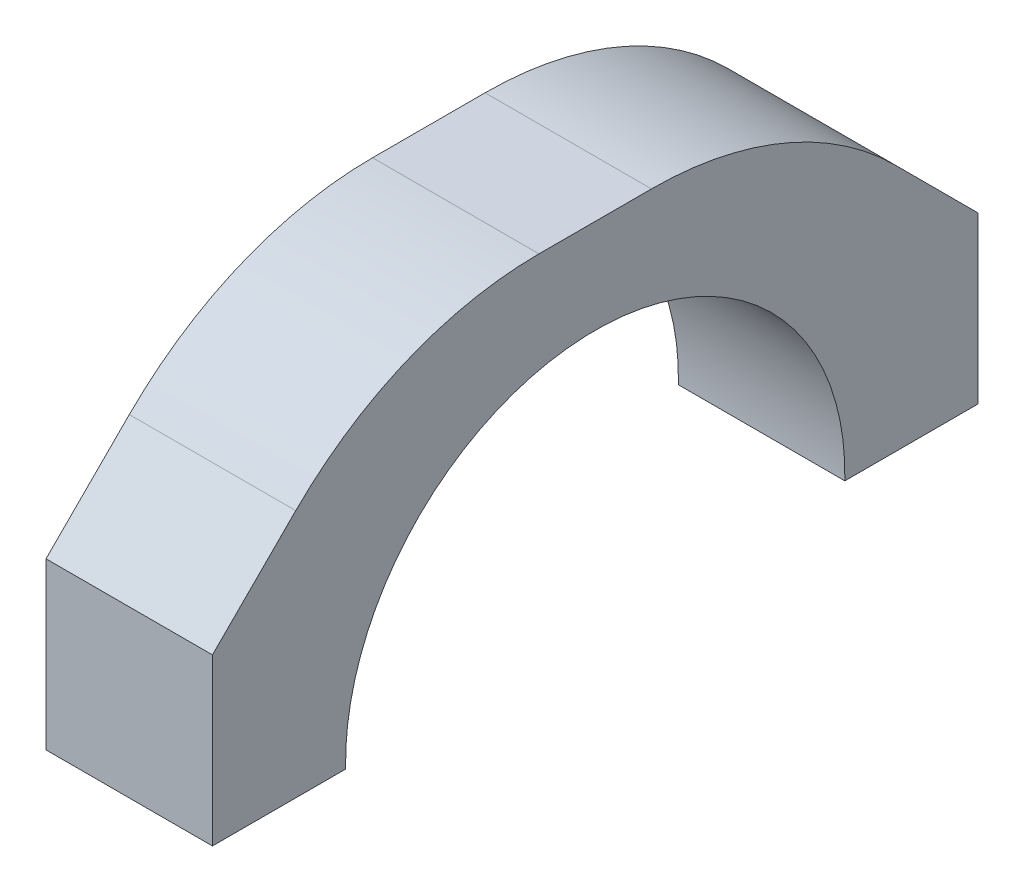
ISO-10303-21;
HEADER;
FILE_DESCRIPTION(('STEP AP214'),'2;1');
FILE_NAME('part.step','',(''),(''),'','','');
FILE_SCHEMA(('AUTOMOTIVE_DESIGN { 1 0 10303 214 1 1 1 1 }'));
ENDSEC;
DATA;
#1=APPLICATION_CONTEXT('core data for automotive mechanical design processes');
#2=APPLICATION_PROTOCOL_DEFINITION('international standard','automotive_design',2000,#1);
#3=PRODUCT_CONTEXT('',#1,'mechanical');
#4=PRODUCT('Part','Part','',(#3));
#5=PRODUCT_RELATED_PRODUCT_CATEGORY('part','',(#4));
#6=PRODUCT_DEFINITION_FORMATION('','',#4);
#7=PRODUCT_DEFINITION_CONTEXT('part definition',#1,'design');
#8=PRODUCT_DEFINITION('design','',#6,#7);
#9=PRODUCT_DEFINITION_SHAPE('','',#8);
#10=(LENGTH_UNIT() NAMED_UNIT(*) SI_UNIT(.MILLI.,.METRE.));
#11=(NAMED_UNIT(*) PLANE_ANGLE_UNIT() SI_UNIT($,.RADIAN.));
#12=(NAMED_UNIT(*) SI_UNIT($,.STERADIAN.) SOLID_ANGLE_UNIT());
#13=UNCERTAINTY_MEASURE_WITH_UNIT(LENGTH_MEASURE(1.E-05),#10,'distance_accuracy_value','');
#14=(GEOMETRIC_REPRESENTATION_CONTEXT(3) GLOBAL_UNCERTAINTY_ASSIGNED_CONTEXT((#13)) GLOBAL_UNIT_ASSIGNED_CONTEXT((#10,
#11,#12)) REPRESENTATION_CONTEXT('',''));
#15=CARTESIAN_POINT('',(0.,0.,0.));
#16=DIRECTION('',(0.,0.,1.));
#17=DIRECTION('',(1.,0.,0.));
#18=AXIS2_PLACEMENT_3D('',#15,#16,#17);
#19=CARTESIAN_POINT('',(-3.,-30.5,-34.4946802489415));
#20=DIRECTION('',(0.,0.,-1.));
#21=DIRECTION('',(-1.,0.,0.));
#22=AXIS2_PLACEMENT_3D('',#19,#20,#21);
#23=PLANE('',#22);
#24=DIRECTION('',(0.,1.,0.));
#25=VECTOR('',#24,1.);
#26=CARTESIAN_POINT('',(12.,-30.5,-34.4946802489415));
#27=LINE('',#26,#25);
#28=CARTESIAN_POINT('',(12.,-30.5,-34.4946802489415));
#29=VERTEX_POINT('',#28);
#30=CARTESIAN_POINT('',(12.,-15.585786437627,-34.4946802489415));
#31=VERTEX_POINT('',#30);
#32=EDGE_CURVE('E157',#29,#31,#27,.T.);
#33=ORIENTED_EDGE('',*,*,#32,.F.);
#34=DIRECTION('',(1.,0.,0.));
#35=VECTOR('',#34,1.);
#36=CARTESIAN_POINT('',(-3.,-30.5,-34.4946802489415));
#37=LINE('',#36,#35);
#38=CARTESIAN_POINT('',(-3.,-30.5,-34.4946802489415));
#39=VERTEX_POINT('',#38);
#40=EDGE_CURVE('E13',#39,#29,#37,.T.);
#41=ORIENTED_EDGE('',*,*,#40,.F.);
#42=DIRECTION('',(0.,1.,0.));
#43=VECTOR('',#42,1.);
#44=CARTESIAN_POINT('',(-3.,-30.5,-34.4946802489415));
#45=LINE('',#44,#43);
#46=CARTESIAN_POINT('',(-3.,-15.585786437627,-34.4946802489415));
#47=VERTEX_POINT('',#46);
#48=EDGE_CURVE('E183',#39,#47,#45,.T.);
#49=ORIENTED_EDGE('',*,*,#48,.T.);
#50=DIRECTION('',(1.,0.,0.));
#51=VECTOR('',#50,1.);
#52=CARTESIAN_POINT('',(-3.,-15.585786437627,-34.4946802489415));
#53=LINE('',#52,#51);
#54=EDGE_CURVE('E51',#47,#31,#53,.T.);
#55=ORIENTED_EDGE('',*,*,#54,.T.);
#56=EDGE_LOOP('',(#33,#41,#49,#55));
#57=FACE_BOUND('',#56,.T.);
#58=ADVANCED_FACE('F47',(#57),#23,.T.);
#59=CARTESIAN_POINT('',(-3.,-30.5,-22.494443758404));
#60=DIRECTION('',(0.,-1.,0.));
#61=DIRECTION('',(0.,0.,-1.));
#62=AXIS2_PLACEMENT_3D('',#59,#60,#61);
#63=PLANE('',#62);
#64=DIRECTION('',(0.,0.,-1.));
#65=VECTOR('',#64,1.);
#66=CARTESIAN_POINT('',(12.,-30.5,-22.494443758404));
#67=LINE('',#66,#65);
#68=CARTESIAN_POINT('',(12.,-30.5,-22.494443758404));
#69=VERTEX_POINT('',#68);
#70=EDGE_CURVE('E181',#69,#29,#67,.T.);
#71=ORIENTED_EDGE('',*,*,#70,.F.);
#72=DIRECTION('',(1.,0.,0.));
#73=VECTOR('',#72,1.);
#74=CARTESIAN_POINT('',(-3.,-30.5,-22.494443758404));
#75=LINE('',#74,#73);
#76=CARTESIAN_POINT('',(-3.,-30.5,-22.494443758404));
#77=VERTEX_POINT('',#76);
#78=EDGE_CURVE('E57',#77,#69,#75,.T.);
#79=ORIENTED_EDGE('',*,*,#78,.F.);
#80=DIRECTION('',(0.,0.,-1.));
#81=VECTOR('',#80,1.);
#82=CARTESIAN_POINT('',(-3.,-30.5,-22.494443758404));
#83=LINE('',#82,#81);
#84=EDGE_CURVE('E147',#77,#39,#83,.T.);
#85=ORIENTED_EDGE('',*,*,#84,.T.);
#86=ORIENTED_EDGE('',*,*,#40,.T.);
#87=EDGE_LOOP('',(#71,#79,#85,#86));
#88=FACE_BOUND('',#87,.T.);
#89=ADVANCED_FACE('F198',(#88),#63,.T.);
#90=CARTESIAN_POINT('',(-3.,-30.,0.));
#91=DIRECTION('',(1.,0.,0.));
#92=DIRECTION('',(0.,0.,-1.));
#93=AXIS2_PLACEMENT_3D('',#90,#91,#92);
#94=CYLINDRICAL_SURFACE('',#93,22.5);
#95=CARTESIAN_POINT('',(12.,-30.,0.));
#96=DIRECTION('',(-1.,0.,0.));
#97=DIRECTION('',(0.,0.,-1.));
#98=AXIS2_PLACEMENT_3D('',#95,#96,#97);
#99=CIRCLE('',#98,22.5);
#100=CARTESIAN_POINT('',(12.,-30.5,22.4944437584039));
#101=VERTEX_POINT('',#100);
#102=EDGE_CURVE('E134',#101,#69,#99,.T.);
#103=ORIENTED_EDGE('',*,*,#102,.F.);
#104=DIRECTION('',(1.,0.,0.));
#105=VECTOR('',#104,1.);
#106=CARTESIAN_POINT('',(-3.,-30.5,22.4944437584039));
#107=LINE('',#106,#105);
#108=CARTESIAN_POINT('',(-3.,-30.5,22.4944437584039));
#109=VERTEX_POINT('',#108);
#110=EDGE_CURVE('E129',#109,#101,#107,.T.);
#111=ORIENTED_EDGE('',*,*,#110,.F.);
#112=CARTESIAN_POINT('',(-3.,-30.,0.));
#113=DIRECTION('',(-1.,0.,0.));
#114=DIRECTION('',(0.,0.,-1.));
#115=AXIS2_PLACEMENT_3D('',#112,#113,#114);
#116=CIRCLE('',#115,22.5);
#117=EDGE_CURVE('E132',#109,#77,#116,.T.);
#118=ORIENTED_EDGE('',*,*,#117,.T.);
#119=ORIENTED_EDGE('',*,*,#78,.T.);
#120=EDGE_LOOP('',(#103,#111,#118,#119));
#121=FACE_BOUND('',#120,.T.);
#122=ADVANCED_FACE('F131',(#121),#94,.F.);
#123=CARTESIAN_POINT('',(-3.,-30.5,34.4946802489414));
#124=DIRECTION('',(0.,-1.,0.));
#125=DIRECTION('',(0.,0.,-1.));
#126=AXIS2_PLACEMENT_3D('',#123,#124,#125);
#127=PLANE('',#126);
#128=DIRECTION('',(0.,0.,-1.));
#129=VECTOR('',#128,1.);
#130=CARTESIAN_POINT('',(12.,-30.5,34.4946802489414));
#131=LINE('',#130,#129);
#132=CARTESIAN_POINT('',(12.,-30.5,34.4946802489414));
#133=VERTEX_POINT('',#132);
#134=EDGE_CURVE('E178',#133,#101,#131,.T.);
#135=ORIENTED_EDGE('',*,*,#134,.F.);
#136=DIRECTION('',(1.,0.,0.));
#137=VECTOR('',#136,1.);
#138=CARTESIAN_POINT('',(-3.,-30.5,34.4946802489414));
#139=LINE('',#138,#137);
#140=CARTESIAN_POINT('',(-3.,-30.5,34.4946802489414));
#141=VERTEX_POINT('',#140);
#142=EDGE_CURVE('E139',#141,#133,#139,.T.);
#143=ORIENTED_EDGE('',*,*,#142,.F.);
#144=DIRECTION('',(0.,0.,-1.));
#145=VECTOR('',#144,1.);
#146=CARTESIAN_POINT('',(-3.,-30.5,34.4946802489414));
#147=LINE('',#146,#145);
#148=EDGE_CURVE('E145',#141,#109,#147,.T.);
#149=ORIENTED_EDGE('',*,*,#148,.T.);
#150=ORIENTED_EDGE('',*,*,#110,.T.);
#151=EDGE_LOOP('',(#135,#143,#149,#150));
#152=FACE_BOUND('',#151,.T.);
#153=ADVANCED_FACE('F149',(#152),#127,.T.);
#154=CARTESIAN_POINT('',(-3.,-15.5857864376269,34.4946802489414));
#155=DIRECTION('',(0.,0.,1.));
#156=DIRECTION('',(1.,0.,0.));
#157=AXIS2_PLACEMENT_3D('',#154,#155,#156);
#158=PLANE('',#157);
#159=DIRECTION('',(0.,-1.,0.));
#160=VECTOR('',#159,1.);
#161=CARTESIAN_POINT('',(12.,-15.5857864376269,34.4946802489414));
#162=LINE('',#161,#160);
#163=CARTESIAN_POINT('',(12.,-15.5857864376269,34.4946802489414));
#164=VERTEX_POINT('',#163);
#165=EDGE_CURVE('E175',#164,#133,#162,.T.);
#166=ORIENTED_EDGE('',*,*,#165,.F.);
#167=DIRECTION('',(1.,0.,0.));
#168=VECTOR('',#167,1.);
#169=CARTESIAN_POINT('',(-3.,-15.5857864376269,34.4946802489414));
#170=LINE('',#169,#168);
#171=CARTESIAN_POINT('',(-3.,-15.5857864376269,34.4946802489414));
#172=VERTEX_POINT('',#171);
#173=EDGE_CURVE('E187',#172,#164,#170,.T.);
#174=ORIENTED_EDGE('',*,*,#173,.F.);
#175=DIRECTION('',(0.,-1.,0.));
#176=VECTOR('',#175,1.);
#177=CARTESIAN_POINT('',(-3.,-15.5857864376269,34.4946802489414));
#178=LINE('',#177,#176);
#179=EDGE_CURVE('E150',#172,#141,#178,.T.);
#180=ORIENTED_EDGE('',*,*,#179,.T.);
#181=ORIENTED_EDGE('',*,*,#142,.T.);
#182=EDGE_LOOP('',(#166,#174,#180,#181));
#183=FACE_BOUND('',#182,.T.);
#184=ADVANCED_FACE('F210',(#183),#158,.T.);
#185=CARTESIAN_POINT('',(-3.,-8.07968978321699,26.9885835945315));
#186=DIRECTION('',(0.,0.707106781186547,0.707106781186548));
#187=DIRECTION('',(0.,-0.707106781186548,0.707106781186547));
#188=AXIS2_PLACEMENT_3D('',#185,#186,#187);
#189=PLANE('',#188);
#190=DIRECTION('',(0.,-0.707106781186548,0.707106781186547));
#191=VECTOR('',#190,1.);
#192=CARTESIAN_POINT('',(12.,-8.07968978321699,26.9885835945315));
#193=LINE('',#192,#191);
#194=CARTESIAN_POINT('',(12.,-8.07968978321699,26.9885835945315));
#195=VERTEX_POINT('',#194);
#196=EDGE_CURVE('E172',#195,#164,#193,.T.);
#197=ORIENTED_EDGE('',*,*,#196,.F.);
#198=DIRECTION('',(1.,0.,0.));
#199=VECTOR('',#198,1.);
#200=CARTESIAN_POINT('',(-3.,-8.07968978321699,26.9885835945315));
#201=LINE('',#200,#199);
#202=CARTESIAN_POINT('',(-3.,-8.07968978321699,26.9885835945315));
#203=VERTEX_POINT('',#202);
#204=EDGE_CURVE('E189',#203,#195,#201,.T.);
#205=ORIENTED_EDGE('',*,*,#204,.F.);
#206=DIRECTION('',(0.,-0.707106781186548,0.707106781186547));
#207=VECTOR('',#206,1.);
#208=CARTESIAN_POINT('',(-3.,-8.07968978321699,26.9885835945315));
#209=LINE('',#208,#207);
#210=EDGE_CURVE('E152',#203,#172,#209,.T.);
#211=ORIENTED_EDGE('',*,*,#210,.T.);
#212=ORIENTED_EDGE('',*,*,#173,.T.);
#213=EDGE_LOOP('',(#197,#205,#211,#212));
#214=FACE_BOUND('',#213,.T.);
#215=ADVANCED_FACE('F213',(#214),#189,.T.);
#216=CARTESIAN_POINT('',(-3.,-30.,5.0682733777486));
#217=DIRECTION('',(1.,0.,0.));
#218=DIRECTION('',(0.,0.,-1.));
#219=AXIS2_PLACEMENT_3D('',#216,#217,#218);
#220=CYLINDRICAL_SURFACE('',#219,31.);
#221=CARTESIAN_POINT('',(12.,-30.,5.0682733777486));
#222=DIRECTION('',(1.,0.,0.));
#223=DIRECTION('',(0.,0.,-1.));
#224=AXIS2_PLACEMENT_3D('',#221,#222,#223);
#225=CIRCLE('',#224,31.);
#226=CARTESIAN_POINT('',(12.,1.,5.0682733777486));
#227=VERTEX_POINT('',#226);
#228=EDGE_CURVE('E169',#227,#195,#225,.T.);
#229=ORIENTED_EDGE('',*,*,#228,.F.);
#230=DIRECTION('',(1.,0.,0.));
#231=VECTOR('',#230,1.);
#232=CARTESIAN_POINT('',(-3.,1.,5.0682733777486));
#233=LINE('',#232,#231);
#234=CARTESIAN_POINT('',(-3.,1.,5.0682733777486));
#235=VERTEX_POINT('',#234);
#236=EDGE_CURVE('E191',#235,#227,#233,.T.);
#237=ORIENTED_EDGE('',*,*,#236,.F.);
#238=CARTESIAN_POINT('',(-3.,-30.,5.0682733777486));
#239=DIRECTION('',(1.,0.,0.));
#240=DIRECTION('',(0.,0.,-1.));
#241=AXIS2_PLACEMENT_3D('',#238,#239,#240);
#242=CIRCLE('',#241,31.);
#243=EDGE_CURVE('E316',#235,#203,#242,.T.);
#244=ORIENTED_EDGE('',*,*,#243,.T.);
#245=ORIENTED_EDGE('',*,*,#204,.T.);
#246=EDGE_LOOP('',(#229,#237,#244,#245));
#247=FACE_BOUND('',#246,.T.);
#248=ADVANCED_FACE('F217',(#247),#220,.T.);
#249=CARTESIAN_POINT('',(-3.,1.00000000000001,-5.06827337774855));
#250=DIRECTION('',(0.,1.,0.));
#251=DIRECTION('',(0.,0.,1.));
#252=AXIS2_PLACEMENT_3D('',#249,#250,#251);
#253=PLANE('',#252);
#254=DIRECTION('',(0.,0.,1.));
#255=VECTOR('',#254,1.);
#256=CARTESIAN_POINT('',(12.,1.00000000000001,-5.06827337774855));
#257=LINE('',#256,#255);
#258=CARTESIAN_POINT('',(12.,1.,-5.06827337774855));
#259=VERTEX_POINT('',#258);
#260=EDGE_CURVE('E166',#259,#227,#257,.T.);
#261=ORIENTED_EDGE('',*,*,#260,.F.);
#262=DIRECTION('',(1.,0.,0.));
#263=VECTOR('',#262,1.);
#264=CARTESIAN_POINT('',(-3.,1.,-5.06827337774855));
#265=LINE('',#264,#263);
#266=CARTESIAN_POINT('',(-3.,1.,-5.06827337774855));
#267=VERTEX_POINT('',#266);
#268=EDGE_CURVE('E193',#267,#259,#265,.T.);
#269=ORIENTED_EDGE('',*,*,#268,.F.);
#270=DIRECTION('',(0.,0.,1.));
#271=VECTOR('',#270,1.);
#272=CARTESIAN_POINT('',(-3.,1.00000000000001,-5.06827337774855));
#273=LINE('',#272,#271);
#274=EDGE_CURVE('E312',#267,#235,#273,.T.);
#275=ORIENTED_EDGE('',*,*,#274,.T.);
#276=ORIENTED_EDGE('',*,*,#236,.T.);
#277=EDGE_LOOP('',(#261,#269,#275,#276));
#278=FACE_BOUND('',#277,.T.);
#279=ADVANCED_FACE('F221',(#278),#253,.T.);
#280=CARTESIAN_POINT('',(-3.,-30.,-5.06827337774855));
#281=DIRECTION('',(1.,0.,0.));
#282=DIRECTION('',(0.,0.,-1.));
#283=AXIS2_PLACEMENT_3D('',#280,#281,#282);
#284=CYLINDRICAL_SURFACE('',#283,31.);
#285=CARTESIAN_POINT('',(12.,-30.,-5.06827337774855));
#286=DIRECTION('',(1.,0.,0.));
#287=DIRECTION('',(0.,0.,-1.));
#288=AXIS2_PLACEMENT_3D('',#285,#286,#287);
#289=CIRCLE('',#288,31.);
#290=CARTESIAN_POINT('',(12.,-8.07968978321706,-26.9885835945316));
#291=VERTEX_POINT('',#290);
#292=EDGE_CURVE('E163',#291,#259,#289,.T.);
#293=ORIENTED_EDGE('',*,*,#292,.F.);
#294=DIRECTION('',(1.,0.,0.));
#295=VECTOR('',#294,1.);
#296=CARTESIAN_POINT('',(-3.,-8.07968978321706,-26.9885835945316));
#297=LINE('',#296,#295);
#298=CARTESIAN_POINT('',(-3.,-8.07968978321706,-26.9885835945316));
#299=VERTEX_POINT('',#298);
#300=EDGE_CURVE('E194',#299,#291,#297,.T.);
#301=ORIENTED_EDGE('',*,*,#300,.F.);
#302=CARTESIAN_POINT('',(-3.,-30.,-5.06827337774855));
#303=DIRECTION('',(1.,0.,0.));
#304=DIRECTION('',(0.,0.,-1.));
#305=AXIS2_PLACEMENT_3D('',#302,#303,#304);
#306=CIRCLE('',#305,31.);
#307=EDGE_CURVE('E323',#299,#267,#306,.T.);
#308=ORIENTED_EDGE('',*,*,#307,.T.);
#309=ORIENTED_EDGE('',*,*,#268,.T.);
#310=EDGE_LOOP('',(#293,#301,#308,#309));
#311=FACE_BOUND('',#310,.T.);
#312=ADVANCED_FACE('F225',(#311),#284,.T.);
#313=CARTESIAN_POINT('',(-3.,-15.585786437627,-34.4946802489415));
#314=DIRECTION('',(0.,0.707106781186547,-0.707106781186548));
#315=DIRECTION('',(0.,0.707106781186548,0.707106781186547));
#316=AXIS2_PLACEMENT_3D('',#313,#314,#315);
#317=PLANE('',#316);
#318=DIRECTION('',(0.,0.707106781186548,0.707106781186547));
#319=VECTOR('',#318,1.);
#320=CARTESIAN_POINT('',(12.,-15.585786437627,-34.4946802489415));
#321=LINE('',#320,#319);
#322=EDGE_CURVE('E160',#31,#291,#321,.T.);
#323=ORIENTED_EDGE('',*,*,#322,.F.);
#324=ORIENTED_EDGE('',*,*,#54,.F.);
#325=DIRECTION('',(0.,0.707106781186548,0.707106781186547));
#326=VECTOR('',#325,1.);
#327=CARTESIAN_POINT('',(-3.,-15.585786437627,-34.4946802489415));
#328=LINE('',#327,#326);
#329=EDGE_CURVE('E325',#47,#299,#328,.T.);
#330=ORIENTED_EDGE('',*,*,#329,.T.);
#331=ORIENTED_EDGE('',*,*,#300,.T.);
#332=EDGE_LOOP('',(#323,#324,#330,#331));
#333=FACE_BOUND('',#332,.T.);
#334=ADVANCED_FACE('F196',(#333),#317,.T.);
#335=CARTESIAN_POINT('',(-3.,-30.,-5.06827337774855));
#336=DIRECTION('',(1.,0.,0.));
#337=DIRECTION('',(0.,0.,-1.));
#338=AXIS2_PLACEMENT_3D('',#335,#336,#337);
#339=PLANE('',#338);
#340=ORIENTED_EDGE('',*,*,#48,.F.);
#341=ORIENTED_EDGE('',*,*,#84,.F.);
#342=ORIENTED_EDGE('',*,*,#117,.F.);
#343=ORIENTED_EDGE('',*,*,#148,.F.);
#344=ORIENTED_EDGE('',*,*,#179,.F.);
#345=ORIENTED_EDGE('',*,*,#210,.F.);
#346=ORIENTED_EDGE('',*,*,#243,.F.);
#347=ORIENTED_EDGE('',*,*,#274,.F.);
#348=ORIENTED_EDGE('',*,*,#307,.F.);
#349=ORIENTED_EDGE('',*,*,#329,.F.);
#350=EDGE_LOOP('',(#340,#341,#342,#343,#344,#345,#346,#347,#348,#349));
#351=FACE_BOUND('',#350,.T.);
#352=ADVANCED_FACE('F143',(#351),#339,.F.);
#353=CARTESIAN_POINT('',(12.,-30.,0.));
#354=DIRECTION('',(1.,0.,0.));
#355=DIRECTION('',(0.,0.,-1.));
#356=AXIS2_PLACEMENT_3D('',#353,#354,#355);
#357=PLANE('',#356);
#358=ORIENTED_EDGE('',*,*,#32,.T.);
#359=ORIENTED_EDGE('',*,*,#322,.T.);
#360=ORIENTED_EDGE('',*,*,#292,.T.);
#361=ORIENTED_EDGE('',*,*,#260,.T.);
#362=ORIENTED_EDGE('',*,*,#228,.T.);
#363=ORIENTED_EDGE('',*,*,#196,.T.);
#364=ORIENTED_EDGE('',*,*,#165,.T.);
#365=ORIENTED_EDGE('',*,*,#134,.T.);
#366=ORIENTED_EDGE('',*,*,#102,.T.);
#367=ORIENTED_EDGE('',*,*,#70,.T.);
#368=EDGE_LOOP('',(#358,#359,#360,#361,#362,#363,#364,#365,#366,#367));
#369=FACE_BOUND('',#368,.T.);
#370=ADVANCED_FACE('F49',(#369),#357,.T.);
#371=CLOSED_SHELL('',(#58,#89,#122,#153,#184,#215,#248,#279,#312,#334,#352,#370));
#372=MANIFOLD_SOLID_BREP('B2',#371);
#373=ADVANCED_BREP_SHAPE_REPRESENTATION('',(#18,#372),#14);
#374=SHAPE_DEFINITION_REPRESENTATION(#9,#373);
ENDSEC;
END-ISO-10303-21;
